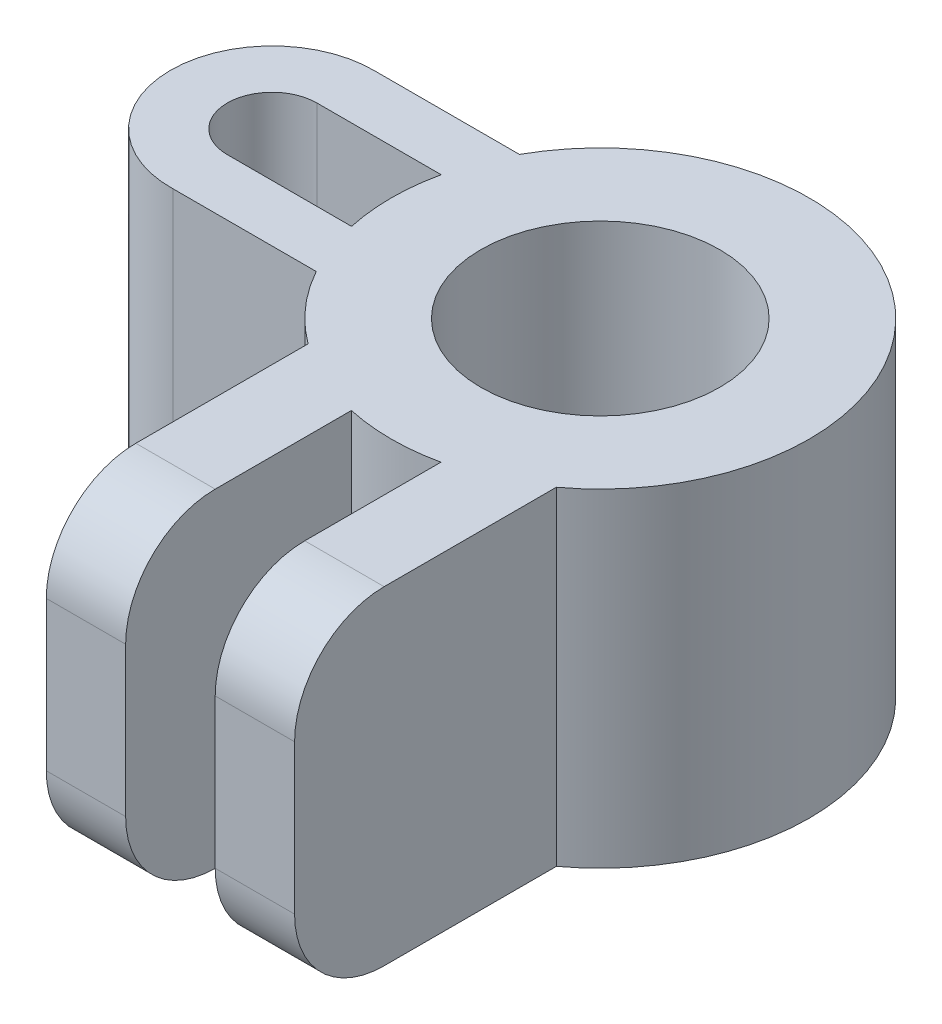
ISO-10303-21;
HEADER;
FILE_DESCRIPTION(('STEP AP214'),'2;1');
FILE_NAME('part.step','',(''),(''),'','','');
FILE_SCHEMA(('AUTOMOTIVE_DESIGN { 1 0 10303 214 1 1 1 1 }'));
ENDSEC;
DATA;
#1=APPLICATION_CONTEXT('core data for automotive mechanical design processes');
#2=APPLICATION_PROTOCOL_DEFINITION('international standard','automotive_design',2000,#1);
#3=PRODUCT_CONTEXT('',#1,'mechanical');
#4=PRODUCT('Part','Part','',(#3));
#5=PRODUCT_RELATED_PRODUCT_CATEGORY('part','',(#4));
#6=PRODUCT_DEFINITION_FORMATION('','',#4);
#7=PRODUCT_DEFINITION_CONTEXT('part definition',#1,'design');
#8=PRODUCT_DEFINITION('design','',#6,#7);
#9=PRODUCT_DEFINITION_SHAPE('','',#8);
#10=(LENGTH_UNIT() NAMED_UNIT(*) SI_UNIT(.MILLI.,.METRE.));
#11=(NAMED_UNIT(*) PLANE_ANGLE_UNIT() SI_UNIT($,.RADIAN.));
#12=(NAMED_UNIT(*) SI_UNIT($,.STERADIAN.) SOLID_ANGLE_UNIT());
#13=UNCERTAINTY_MEASURE_WITH_UNIT(LENGTH_MEASURE(1.E-05),#10,'distance_accuracy_value','');
#14=(GEOMETRIC_REPRESENTATION_CONTEXT(3) GLOBAL_UNCERTAINTY_ASSIGNED_CONTEXT((#13)) GLOBAL_UNIT_ASSIGNED_CONTEXT((#10,
#11,#12)) REPRESENTATION_CONTEXT('',''));
#15=CARTESIAN_POINT('',(0.,0.,0.));
#16=DIRECTION('',(0.,0.,1.));
#17=DIRECTION('',(1.,0.,0.));
#18=AXIS2_PLACEMENT_3D('',#15,#16,#17);
#19=CARTESIAN_POINT('',(0.,55.,0.));
#20=DIRECTION('',(0.,-1.,0.));
#21=DIRECTION('',(0.,0.,-1.));
#22=AXIS2_PLACEMENT_3D('',#19,#20,#21);
#23=CYLINDRICAL_SURFACE('',#22,35.);
#24=CARTESIAN_POINT('',(0.,0.,0.));
#25=DIRECTION('',(0.,1.,0.));
#26=DIRECTION('',(0.,0.,1.));
#27=AXIS2_PLACEMENT_3D('',#24,#25,#26);
#28=CIRCLE('',#27,35.);
#29=CARTESIAN_POINT('',(-7.5,0.,34.1869858279434));
#30=VERTEX_POINT('',#29);
#31=CARTESIAN_POINT('',(7.5,0.,34.1869858279434));
#32=VERTEX_POINT('',#31);
#33=EDGE_CURVE('E261',#30,#32,#28,.T.);
#34=ORIENTED_EDGE('',*,*,#33,.T.);
#35=DIRECTION('',(0.,-1.,0.));
#36=VECTOR('',#35,1.);
#37=CARTESIAN_POINT('',(7.5,55.,34.1869858279434));
#38=LINE('',#37,#36);
#39=CARTESIAN_POINT('',(7.5,55.,34.1869858279434));
#40=VERTEX_POINT('',#39);
#41=EDGE_CURVE('E332',#40,#32,#38,.T.);
#42=ORIENTED_EDGE('',*,*,#41,.F.);
#43=CARTESIAN_POINT('',(0.,55.,0.));
#44=DIRECTION('',(0.,1.,0.));
#45=DIRECTION('',(0.,0.,1.));
#46=AXIS2_PLACEMENT_3D('',#43,#44,#45);
#47=CIRCLE('',#46,35.);
#48=CARTESIAN_POINT('',(-7.5,55.,34.1869858279434));
#49=VERTEX_POINT('',#48);
#50=EDGE_CURVE('E208',#49,#40,#47,.T.);
#51=ORIENTED_EDGE('',*,*,#50,.F.);
#52=DIRECTION('',(0.,-1.,0.));
#53=VECTOR('',#52,1.);
#54=CARTESIAN_POINT('',(-7.5,55.,34.1869858279434));
#55=LINE('',#54,#53);
#56=EDGE_CURVE('E195',#49,#30,#55,.T.);
#57=ORIENTED_EDGE('',*,*,#56,.T.);
#58=EDGE_LOOP('',(#34,#42,#51,#57));
#59=FACE_BOUND('',#58,.T.);
#60=ADVANCED_FACE('F45',(#59),#23,.T.);
#61=CARTESIAN_POINT('',(7.5,55.,0.));
#62=DIRECTION('',(1.,0.,0.));
#63=DIRECTION('',(0.,0.,-1.));
#64=AXIS2_PLACEMENT_3D('',#61,#62,#63);
#65=PLANE('',#64);
#66=DIRECTION('',(0.,-1.,0.));
#67=VECTOR('',#66,1.);
#68=CARTESIAN_POINT('',(7.50000000000001,55.,72.));
#69=LINE('',#68,#67);
#70=CARTESIAN_POINT('',(7.50000000000001,40.,72.));
#71=VERTEX_POINT('',#70);
#72=CARTESIAN_POINT('',(7.50000000000001,15.,72.));
#73=VERTEX_POINT('',#72);
#74=EDGE_CURVE('E328',#71,#73,#69,.T.);
#75=ORIENTED_EDGE('',*,*,#74,.F.);
#76=CARTESIAN_POINT('',(7.50000000000001,40.,57.));
#77=DIRECTION('',(1.,0.,0.));
#78=DIRECTION('',(0.,0.,-1.));
#79=AXIS2_PLACEMENT_3D('',#76,#77,#78);
#80=CIRCLE('',#79,15.);
#81=CARTESIAN_POINT('',(7.50000000000001,55.,57.));
#82=VERTEX_POINT('',#81);
#83=EDGE_CURVE('E366',#71,#82,#80,.F.);
#84=ORIENTED_EDGE('',*,*,#83,.T.);
#85=DIRECTION('',(0.,0.,1.));
#86=VECTOR('',#85,1.);
#87=CARTESIAN_POINT('',(7.5,55.,0.));
#88=LINE('',#87,#86);
#89=EDGE_CURVE('E225',#40,#82,#88,.T.);
#90=ORIENTED_EDGE('',*,*,#89,.F.);
#91=ORIENTED_EDGE('',*,*,#41,.T.);
#92=DIRECTION('',(0.,0.,1.));
#93=VECTOR('',#92,1.);
#94=CARTESIAN_POINT('',(7.5,0.,0.));
#95=LINE('',#94,#93);
#96=CARTESIAN_POINT('',(7.50000000000001,0.,57.));
#97=VERTEX_POINT('',#96);
#98=EDGE_CURVE('E269',#32,#97,#95,.T.);
#99=ORIENTED_EDGE('',*,*,#98,.T.);
#100=CARTESIAN_POINT('',(7.50000000000001,15.,57.));
#101=DIRECTION('',(1.,0.,0.));
#102=DIRECTION('',(0.,0.,-1.));
#103=AXIS2_PLACEMENT_3D('',#100,#101,#102);
#104=CIRCLE('',#103,15.);
#105=EDGE_CURVE('E363',#97,#73,#104,.F.);
#106=ORIENTED_EDGE('',*,*,#105,.T.);
#107=EDGE_LOOP('',(#75,#84,#90,#91,#99,#106));
#108=FACE_BOUND('',#107,.T.);
#109=ADVANCED_FACE('F403',(#108),#65,.F.);
#110=CARTESIAN_POINT('',(0.,55.,72.));
#111=DIRECTION('',(0.,0.,-1.));
#112=DIRECTION('',(-1.,0.,0.));
#113=AXIS2_PLACEMENT_3D('',#110,#111,#112);
#114=PLANE('',#113);
#115=DIRECTION('',(0.,-1.,0.));
#116=VECTOR('',#115,1.);
#117=CARTESIAN_POINT('',(20.7953758307516,55.,72.));
#118=LINE('',#117,#116);
#119=CARTESIAN_POINT('',(20.7953758307516,40.,72.));
#120=VERTEX_POINT('',#119);
#121=CARTESIAN_POINT('',(20.7953758307516,15.,72.));
#122=VERTEX_POINT('',#121);
#123=EDGE_CURVE('E324',#120,#122,#118,.T.);
#124=ORIENTED_EDGE('',*,*,#123,.F.);
#125=DIRECTION('',(1.,0.,0.));
#126=VECTOR('',#125,1.);
#127=CARTESIAN_POINT('',(7.50000000000001,40.,72.));
#128=LINE('',#127,#126);
#129=EDGE_CURVE('E360',#120,#71,#128,.F.);
#130=ORIENTED_EDGE('',*,*,#129,.T.);
#131=ORIENTED_EDGE('',*,*,#74,.T.);
#132=DIRECTION('',(1.,0.,0.));
#133=VECTOR('',#132,1.);
#134=CARTESIAN_POINT('',(0.,15.,72.));
#135=LINE('',#134,#133);
#136=EDGE_CURVE('E356',#73,#122,#135,.T.);
#137=ORIENTED_EDGE('',*,*,#136,.T.);
#138=EDGE_LOOP('',(#124,#130,#131,#137));
#139=FACE_BOUND('',#138,.T.);
#140=ADVANCED_FACE('F466',(#139),#114,.F.);
#141=CARTESIAN_POINT('',(20.7953758307516,55.,0.));
#142=DIRECTION('',(-1.,0.,0.));
#143=DIRECTION('',(0.,0.,1.));
#144=AXIS2_PLACEMENT_3D('',#141,#142,#143);
#145=PLANE('',#144);
#146=DIRECTION('',(0.,0.,-1.));
#147=VECTOR('',#146,1.);
#148=CARTESIAN_POINT('',(20.7953758307516,55.,0.));
#149=LINE('',#148,#147);
#150=CARTESIAN_POINT('',(20.7953758307516,55.,57.));
#151=VERTEX_POINT('',#150);
#152=CARTESIAN_POINT('',(20.7953758307516,55.,28.152306194303));
#153=VERTEX_POINT('',#152);
#154=EDGE_CURVE('E229',#151,#153,#149,.T.);
#155=ORIENTED_EDGE('',*,*,#154,.F.);
#156=CARTESIAN_POINT('',(20.7953758307516,40.,57.));
#157=DIRECTION('',(-1.,0.,0.));
#158=DIRECTION('',(0.,0.,1.));
#159=AXIS2_PLACEMENT_3D('',#156,#157,#158);
#160=CIRCLE('',#159,15.);
#161=EDGE_CURVE('E353',#151,#120,#160,.F.);
#162=ORIENTED_EDGE('',*,*,#161,.T.);
#163=ORIENTED_EDGE('',*,*,#123,.T.);
#164=CARTESIAN_POINT('',(20.7953758307516,15.,57.));
#165=DIRECTION('',(-1.,0.,0.));
#166=DIRECTION('',(0.,0.,1.));
#167=AXIS2_PLACEMENT_3D('',#164,#165,#166);
#168=CIRCLE('',#167,15.);
#169=CARTESIAN_POINT('',(20.7953758307516,0.,57.));
#170=VERTEX_POINT('',#169);
#171=EDGE_CURVE('E350',#122,#170,#168,.F.);
#172=ORIENTED_EDGE('',*,*,#171,.T.);
#173=DIRECTION('',(0.,0.,-1.));
#174=VECTOR('',#173,1.);
#175=CARTESIAN_POINT('',(20.7953758307516,0.,0.));
#176=LINE('',#175,#174);
#177=CARTESIAN_POINT('',(20.7953758307516,0.,28.152306194303));
#178=VERTEX_POINT('',#177);
#179=EDGE_CURVE('E273',#170,#178,#176,.T.);
#180=ORIENTED_EDGE('',*,*,#179,.T.);
#181=DIRECTION('',(0.,-1.,0.));
#182=VECTOR('',#181,1.);
#183=CARTESIAN_POINT('',(20.7953758307516,55.,28.152306194303));
#184=LINE('',#183,#182);
#185=EDGE_CURVE('E320',#153,#178,#184,.T.);
#186=ORIENTED_EDGE('',*,*,#185,.F.);
#187=EDGE_LOOP('',(#155,#162,#163,#172,#180,#186));
#188=FACE_BOUND('',#187,.T.);
#189=ADVANCED_FACE('F412',(#188),#145,.F.);
#190=CARTESIAN_POINT('',(-30.5769903405261,0.,-17.0307857045814));
#191=VERTEX_POINT('',#190);
#192=EDGE_CURVE('E276',#178,#191,#28,.T.);
#193=ORIENTED_EDGE('',*,*,#192,.T.);
#194=DIRECTION('',(0.,-1.,0.));
#195=VECTOR('',#194,1.);
#196=CARTESIAN_POINT('',(-30.5769903405261,55.,-17.0307857045814));
#197=LINE('',#196,#195);
#198=CARTESIAN_POINT('',(-30.5769903405261,55.,-17.0307857045814));
#199=VERTEX_POINT('',#198);
#200=EDGE_CURVE('E316',#199,#191,#197,.T.);
#201=ORIENTED_EDGE('',*,*,#200,.F.);
#202=EDGE_CURVE('E232',#153,#199,#47,.T.);
#203=ORIENTED_EDGE('',*,*,#202,.F.);
#204=ORIENTED_EDGE('',*,*,#185,.T.);
#205=EDGE_LOOP('',(#193,#201,#203,#204));
#206=FACE_BOUND('',#205,.T.);
#207=ADVANCED_FACE('F419',(#206),#23,.T.);
#208=CARTESIAN_POINT('',(0.,55.,-17.0307857045814));
#209=DIRECTION('',(0.,0.,1.));
#210=DIRECTION('',(1.,0.,0.));
#211=AXIS2_PLACEMENT_3D('',#208,#209,#210);
#212=PLANE('',#211);
#213=DIRECTION('',(-1.,0.,0.));
#214=VECTOR('',#213,1.);
#215=CARTESIAN_POINT('',(0.,0.,-17.0307857045814));
#216=LINE('',#215,#214);
#217=CARTESIAN_POINT('',(-54.5769903405261,0.,-17.0307857045814));
#218=VERTEX_POINT('',#217);
#219=EDGE_CURVE('E277',#191,#218,#216,.T.);
#220=ORIENTED_EDGE('',*,*,#219,.T.);
#221=DIRECTION('',(0.,-1.,0.));
#222=VECTOR('',#221,1.);
#223=CARTESIAN_POINT('',(-54.5769903405261,55.,-17.0307857045814));
#224=LINE('',#223,#222);
#225=CARTESIAN_POINT('',(-54.5769903405261,55.,-17.0307857045814));
#226=VERTEX_POINT('',#225);
#227=EDGE_CURVE('E312',#226,#218,#224,.T.);
#228=ORIENTED_EDGE('',*,*,#227,.F.);
#229=DIRECTION('',(-1.,0.,0.));
#230=VECTOR('',#229,1.);
#231=CARTESIAN_POINT('',(0.,55.,-17.0307857045814));
#232=LINE('',#231,#230);
#233=EDGE_CURVE('E233',#199,#226,#232,.T.);
#234=ORIENTED_EDGE('',*,*,#233,.F.);
#235=ORIENTED_EDGE('',*,*,#200,.T.);
#236=EDGE_LOOP('',(#220,#228,#234,#235));
#237=FACE_BOUND('',#236,.T.);
#238=ADVANCED_FACE('F426',(#237),#212,.F.);
#239=CARTESIAN_POINT('',(-54.9999911538681,55.,-0.0311941410011966));
#240=DIRECTION('',(0.,-1.,0.));
#241=DIRECTION('',(0.,0.,-1.));
#242=AXIS2_PLACEMENT_3D('',#239,#240,#241);
#243=CYLINDRICAL_SURFACE('',#242,17.0048535135307);
#244=CARTESIAN_POINT('',(-54.9999911538681,0.,-0.0311941410011966));
#245=DIRECTION('',(0.,1.,0.));
#246=DIRECTION('',(0.,0.,1.));
#247=AXIS2_PLACEMENT_3D('',#244,#245,#246);
#248=CIRCLE('',#247,17.0048535135307);
#249=CARTESIAN_POINT('',(-54.6112032791291,0.,16.9692142954186));
#250=VERTEX_POINT('',#249);
#251=EDGE_CURVE('E280',#218,#250,#248,.T.);
#252=ORIENTED_EDGE('',*,*,#251,.T.);
#253=DIRECTION('',(0.,-1.,0.));
#254=VECTOR('',#253,1.);
#255=CARTESIAN_POINT('',(-54.6112032791291,55.,16.9692142954186));
#256=LINE('',#255,#254);
#257=CARTESIAN_POINT('',(-54.6112032791291,55.,16.9692142954186));
#258=VERTEX_POINT('',#257);
#259=EDGE_CURVE('E309',#258,#250,#256,.T.);
#260=ORIENTED_EDGE('',*,*,#259,.F.);
#261=CARTESIAN_POINT('',(-54.9999911538681,55.,-0.0311941410011966));
#262=DIRECTION('',(0.,1.,0.));
#263=DIRECTION('',(0.,0.,1.));
#264=AXIS2_PLACEMENT_3D('',#261,#262,#263);
#265=CIRCLE('',#264,17.0048535135307);
#266=EDGE_CURVE('E236',#226,#258,#265,.T.);
#267=ORIENTED_EDGE('',*,*,#266,.F.);
#268=ORIENTED_EDGE('',*,*,#227,.T.);
#269=EDGE_LOOP('',(#252,#260,#267,#268));
#270=FACE_BOUND('',#269,.T.);
#271=ADVANCED_FACE('F430',(#270),#243,.T.);
#272=CARTESIAN_POINT('',(0.,55.,16.9692142954186));
#273=DIRECTION('',(0.,0.,1.));
#274=DIRECTION('',(1.,0.,0.));
#275=AXIS2_PLACEMENT_3D('',#272,#273,#274);
#276=PLANE('',#275);
#277=DIRECTION('',(-1.,0.,0.));
#278=VECTOR('',#277,1.);
#279=CARTESIAN_POINT('',(0.,0.,16.9692142954186));
#280=LINE('',#279,#278);
#281=CARTESIAN_POINT('',(-30.6112032791291,0.,16.9692142954186));
#282=VERTEX_POINT('',#281);
#283=EDGE_CURVE('E284',#282,#250,#280,.T.);
#284=ORIENTED_EDGE('',*,*,#283,.F.);
#285=DIRECTION('',(0.,-1.,0.));
#286=VECTOR('',#285,1.);
#287=CARTESIAN_POINT('',(-30.6112032791291,55.,16.9692142954186));
#288=LINE('',#287,#286);
#289=CARTESIAN_POINT('',(-30.6112032791291,55.,16.9692142954186));
#290=VERTEX_POINT('',#289);
#291=EDGE_CURVE('E306',#290,#282,#288,.T.);
#292=ORIENTED_EDGE('',*,*,#291,.F.);
#293=DIRECTION('',(-1.,0.,0.));
#294=VECTOR('',#293,1.);
#295=CARTESIAN_POINT('',(0.,55.,16.9692142954186));
#296=LINE('',#295,#294);
#297=EDGE_CURVE('E239',#290,#258,#296,.T.);
#298=ORIENTED_EDGE('',*,*,#297,.T.);
#299=ORIENTED_EDGE('',*,*,#259,.T.);
#300=EDGE_LOOP('',(#284,#292,#298,#299));
#301=FACE_BOUND('',#300,.T.);
#302=ADVANCED_FACE('F433',(#301),#276,.T.);
#303=CARTESIAN_POINT('',(-20.7953758307516,0.,28.152306194303));
#304=VERTEX_POINT('',#303);
#305=EDGE_CURVE('E260',#282,#304,#28,.T.);
#306=ORIENTED_EDGE('',*,*,#305,.T.);
#307=DIRECTION('',(0.,-1.,0.));
#308=VECTOR('',#307,1.);
#309=CARTESIAN_POINT('',(-20.7953758307516,55.,28.152306194303));
#310=LINE('',#309,#308);
#311=CARTESIAN_POINT('',(-20.7953758307516,55.,28.152306194303));
#312=VERTEX_POINT('',#311);
#313=EDGE_CURVE('E302',#312,#304,#310,.T.);
#314=ORIENTED_EDGE('',*,*,#313,.F.);
#315=EDGE_CURVE('E207',#290,#312,#47,.T.);
#316=ORIENTED_EDGE('',*,*,#315,.F.);
#317=ORIENTED_EDGE('',*,*,#291,.T.);
#318=EDGE_LOOP('',(#306,#314,#316,#317));
#319=FACE_BOUND('',#318,.T.);
#320=ADVANCED_FACE('F440',(#319),#23,.T.);
#321=CARTESIAN_POINT('',(-20.7953758307516,55.,0.));
#322=DIRECTION('',(-1.,0.,0.));
#323=DIRECTION('',(0.,0.,1.));
#324=AXIS2_PLACEMENT_3D('',#321,#322,#323);
#325=PLANE('',#324);
#326=DIRECTION('',(0.,0.,-1.));
#327=VECTOR('',#326,1.);
#328=CARTESIAN_POINT('',(-20.7953758307516,0.,0.));
#329=LINE('',#328,#327);
#330=CARTESIAN_POINT('',(-20.7953758307516,0.,57.));
#331=VERTEX_POINT('',#330);
#332=EDGE_CURVE('E288',#331,#304,#329,.T.);
#333=ORIENTED_EDGE('',*,*,#332,.F.);
#334=CARTESIAN_POINT('',(-20.7953758307516,15.,57.));
#335=DIRECTION('',(-1.,0.,0.));
#336=DIRECTION('',(0.,0.,1.));
#337=AXIS2_PLACEMENT_3D('',#334,#335,#336);
#338=CIRCLE('',#337,15.);
#339=CARTESIAN_POINT('',(-20.7953758307516,15.,72.));
#340=VERTEX_POINT('',#339);
#341=EDGE_CURVE('E379',#331,#340,#338,.T.);
#342=ORIENTED_EDGE('',*,*,#341,.T.);
#343=DIRECTION('',(0.,-1.,0.));
#344=VECTOR('',#343,1.);
#345=CARTESIAN_POINT('',(-20.7953758307516,55.,72.));
#346=LINE('',#345,#344);
#347=CARTESIAN_POINT('',(-20.7953758307516,40.,72.));
#348=VERTEX_POINT('',#347);
#349=EDGE_CURVE('E299',#348,#340,#346,.T.);
#350=ORIENTED_EDGE('',*,*,#349,.F.);
#351=CARTESIAN_POINT('',(-20.7953758307516,40.,57.));
#352=DIRECTION('',(-1.,0.,0.));
#353=DIRECTION('',(0.,0.,1.));
#354=AXIS2_PLACEMENT_3D('',#351,#352,#353);
#355=CIRCLE('',#354,15.);
#356=CARTESIAN_POINT('',(-20.7953758307516,55.,57.));
#357=VERTEX_POINT('',#356);
#358=EDGE_CURVE('E376',#348,#357,#355,.T.);
#359=ORIENTED_EDGE('',*,*,#358,.T.);
#360=DIRECTION('',(0.,0.,-1.));
#361=VECTOR('',#360,1.);
#362=CARTESIAN_POINT('',(-20.7953758307516,55.,0.));
#363=LINE('',#362,#361);
#364=EDGE_CURVE('E243',#357,#312,#363,.T.);
#365=ORIENTED_EDGE('',*,*,#364,.T.);
#366=ORIENTED_EDGE('',*,*,#313,.T.);
#367=EDGE_LOOP('',(#333,#342,#350,#359,#365,#366));
#368=FACE_BOUND('',#367,.T.);
#369=ADVANCED_FACE('F444',(#368),#325,.T.);
#370=CARTESIAN_POINT('',(0.,55.,72.));
#371=DIRECTION('',(0.,0.,1.));
#372=DIRECTION('',(1.,0.,0.));
#373=AXIS2_PLACEMENT_3D('',#370,#371,#372);
#374=PLANE('',#373);
#375=ORIENTED_EDGE('',*,*,#349,.T.);
#376=DIRECTION('',(-1.,0.,0.));
#377=VECTOR('',#376,1.);
#378=CARTESIAN_POINT('',(-7.49999999999999,15.,72.));
#379=LINE('',#378,#377);
#380=CARTESIAN_POINT('',(-7.49999999999999,15.,72.));
#381=VERTEX_POINT('',#380);
#382=EDGE_CURVE('E61',#340,#381,#379,.F.);
#383=ORIENTED_EDGE('',*,*,#382,.T.);
#384=DIRECTION('',(0.,-1.,0.));
#385=VECTOR('',#384,1.);
#386=CARTESIAN_POINT('',(-7.49999999999999,55.,72.));
#387=LINE('',#386,#385);
#388=CARTESIAN_POINT('',(-7.49999999999999,40.,72.));
#389=VERTEX_POINT('',#388);
#390=EDGE_CURVE('E296',#389,#381,#387,.T.);
#391=ORIENTED_EDGE('',*,*,#390,.F.);
#392=DIRECTION('',(-1.,0.,0.));
#393=VECTOR('',#392,1.);
#394=CARTESIAN_POINT('',(0.,40.,72.));
#395=LINE('',#394,#393);
#396=EDGE_CURVE('E382',#389,#348,#395,.T.);
#397=ORIENTED_EDGE('',*,*,#396,.T.);
#398=EDGE_LOOP('',(#375,#383,#391,#397));
#399=FACE_BOUND('',#398,.T.);
#400=ADVANCED_FACE('F448',(#399),#374,.T.);
#401=CARTESIAN_POINT('',(0.,55.,-7.53118789916653));
#402=DIRECTION('',(0.,0.,1.));
#403=DIRECTION('',(1.,0.,0.));
#404=AXIS2_PLACEMENT_3D('',#401,#402,#403);
#405=PLANE('',#404);
#406=DIRECTION('',(-1.,0.,0.));
#407=VECTOR('',#406,1.);
#408=CARTESIAN_POINT('',(0.,0.,-7.53118789916653));
#409=LINE('',#408,#407);
#410=CARTESIAN_POINT('',(-34.1801288591405,0.,-7.53118789916653));
#411=VERTEX_POINT('',#410);
#412=CARTESIAN_POINT('',(-54.9863070375236,0.,-7.53118789916653));
#413=VERTEX_POINT('',#412);
#414=EDGE_CURVE('E190',#411,#413,#409,.T.);
#415=ORIENTED_EDGE('',*,*,#414,.F.);
#416=DIRECTION('',(0.,-1.,0.));
#417=VECTOR('',#416,1.);
#418=CARTESIAN_POINT('',(-34.1801288591405,55.,-7.53118789916653));
#419=LINE('',#418,#417);
#420=CARTESIAN_POINT('',(-34.1801288591405,55.,-7.53118789916653));
#421=VERTEX_POINT('',#420);
#422=EDGE_CURVE('E183',#421,#411,#419,.T.);
#423=ORIENTED_EDGE('',*,*,#422,.F.);
#424=DIRECTION('',(-1.,0.,0.));
#425=VECTOR('',#424,1.);
#426=CARTESIAN_POINT('',(0.,55.,-7.53118789916653));
#427=LINE('',#426,#425);
#428=CARTESIAN_POINT('',(-54.9863070375236,55.,-7.53118789916653));
#429=VERTEX_POINT('',#428);
#430=EDGE_CURVE('E187',#421,#429,#427,.T.);
#431=ORIENTED_EDGE('',*,*,#430,.T.);
#432=DIRECTION('',(0.,-1.,0.));
#433=VECTOR('',#432,1.);
#434=CARTESIAN_POINT('',(-54.9863070375236,55.,-7.53118789916653));
#435=LINE('',#434,#433);
#436=EDGE_CURVE('E253',#429,#413,#435,.T.);
#437=ORIENTED_EDGE('',*,*,#436,.T.);
#438=EDGE_LOOP('',(#415,#423,#431,#437));
#439=FACE_BOUND('',#438,.T.);
#440=ADVANCED_FACE('F185',(#439),#405,.T.);
#441=CARTESIAN_POINT('',(-34.193812975485,0.,7.46881210083347));
#442=VERTEX_POINT('',#441);
#443=EDGE_CURVE('E256',#411,#442,#28,.T.);
#444=ORIENTED_EDGE('',*,*,#443,.T.);
#445=DIRECTION('',(0.,-1.,0.));
#446=VECTOR('',#445,1.);
#447=CARTESIAN_POINT('',(-34.193812975485,55.,7.46881210083347));
#448=LINE('',#447,#446);
#449=CARTESIAN_POINT('',(-34.193812975485,55.,7.46881210083347));
#450=VERTEX_POINT('',#449);
#451=EDGE_CURVE('E196',#450,#442,#448,.T.);
#452=ORIENTED_EDGE('',*,*,#451,.F.);
#453=EDGE_CURVE('E199',#421,#450,#47,.T.);
#454=ORIENTED_EDGE('',*,*,#453,.F.);
#455=ORIENTED_EDGE('',*,*,#422,.T.);
#456=EDGE_LOOP('',(#444,#452,#454,#455));
#457=FACE_BOUND('',#456,.T.);
#458=ADVANCED_FACE('F200',(#457),#23,.T.);
#459=CARTESIAN_POINT('',(0.,55.,7.46881210083347));
#460=DIRECTION('',(0.,0.,-1.));
#461=DIRECTION('',(-1.,0.,0.));
#462=AXIS2_PLACEMENT_3D('',#459,#460,#461);
#463=PLANE('',#462);
#464=DIRECTION('',(1.,0.,0.));
#465=VECTOR('',#464,1.);
#466=CARTESIAN_POINT('',(0.,0.,7.46881210083347));
#467=LINE('',#466,#465);
#468=CARTESIAN_POINT('',(-54.9999911538681,0.,7.46881210083347));
#469=VERTEX_POINT('',#468);
#470=EDGE_CURVE('E259',#469,#442,#467,.T.);
#471=ORIENTED_EDGE('',*,*,#470,.F.);
#472=DIRECTION('',(0.,-1.,0.));
#473=VECTOR('',#472,1.);
#474=CARTESIAN_POINT('',(-54.9999911538681,55.,7.46881210083347));
#475=LINE('',#474,#473);
#476=CARTESIAN_POINT('',(-54.9999911538681,55.,7.46881210083347));
#477=VERTEX_POINT('',#476);
#478=EDGE_CURVE('E339',#477,#469,#475,.T.);
#479=ORIENTED_EDGE('',*,*,#478,.F.);
#480=DIRECTION('',(1.,0.,0.));
#481=VECTOR('',#480,1.);
#482=CARTESIAN_POINT('',(0.,55.,7.46881210083347));
#483=LINE('',#482,#481);
#484=EDGE_CURVE('E205',#477,#450,#483,.T.);
#485=ORIENTED_EDGE('',*,*,#484,.T.);
#486=ORIENTED_EDGE('',*,*,#451,.T.);
#487=EDGE_LOOP('',(#471,#479,#485,#486));
#488=FACE_BOUND('',#487,.T.);
#489=ADVANCED_FACE('F483',(#488),#463,.T.);
#490=CARTESIAN_POINT('',(-7.5,55.,0.));
#491=DIRECTION('',(1.,0.,0.));
#492=DIRECTION('',(0.,0.,-1.));
#493=AXIS2_PLACEMENT_3D('',#490,#491,#492);
#494=PLANE('',#493);
#495=ORIENTED_EDGE('',*,*,#390,.T.);
#496=CARTESIAN_POINT('',(-7.49999999999999,15.,57.));
#497=DIRECTION('',(1.,0.,0.));
#498=DIRECTION('',(0.,0.,-1.));
#499=AXIS2_PLACEMENT_3D('',#496,#497,#498);
#500=CIRCLE('',#499,15.);
#501=CARTESIAN_POINT('',(-7.49999999999999,0.,57.));
#502=VERTEX_POINT('',#501);
#503=EDGE_CURVE('E11',#381,#502,#500,.T.);
#504=ORIENTED_EDGE('',*,*,#503,.T.);
#505=DIRECTION('',(0.,0.,1.));
#506=VECTOR('',#505,1.);
#507=CARTESIAN_POINT('',(-7.5,0.,0.));
#508=LINE('',#507,#506);
#509=EDGE_CURVE('E218',#30,#502,#508,.T.);
#510=ORIENTED_EDGE('',*,*,#509,.F.);
#511=ORIENTED_EDGE('',*,*,#56,.F.);
#512=DIRECTION('',(0.,0.,1.));
#513=VECTOR('',#512,1.);
#514=CARTESIAN_POINT('',(-7.5,55.,0.));
#515=LINE('',#514,#513);
#516=CARTESIAN_POINT('',(-7.49999999999999,55.,57.));
#517=VERTEX_POINT('',#516);
#518=EDGE_CURVE('E246',#49,#517,#515,.T.);
#519=ORIENTED_EDGE('',*,*,#518,.T.);
#520=CARTESIAN_POINT('',(-7.49999999999999,40.,57.));
#521=DIRECTION('',(1.,0.,0.));
#522=DIRECTION('',(0.,0.,-1.));
#523=AXIS2_PLACEMENT_3D('',#520,#521,#522);
#524=CIRCLE('',#523,15.);
#525=EDGE_CURVE('E54',#517,#389,#524,.T.);
#526=ORIENTED_EDGE('',*,*,#525,.T.);
#527=EDGE_LOOP('',(#495,#504,#510,#511,#519,#526));
#528=FACE_BOUND('',#527,.T.);
#529=ADVANCED_FACE('F450',(#528),#494,.T.);
#530=CARTESIAN_POINT('',(-54.9999911538681,55.,-0.0311941410011966));
#531=DIRECTION('',(0.,-1.,0.));
#532=DIRECTION('',(0.,0.,-1.));
#533=AXIS2_PLACEMENT_3D('',#530,#531,#532);
#534=CYLINDRICAL_SURFACE('',#533,7.50000624183467);
#535=CARTESIAN_POINT('',(-54.9999911538681,0.,-0.0311941410011966));
#536=DIRECTION('',(0.,1.,0.));
#537=DIRECTION('',(0.,0.,1.));
#538=AXIS2_PLACEMENT_3D('',#535,#536,#537);
#539=CIRCLE('',#538,7.50000624183467);
#540=EDGE_CURVE('E265',#413,#469,#539,.T.);
#541=ORIENTED_EDGE('',*,*,#540,.F.);
#542=ORIENTED_EDGE('',*,*,#436,.F.);
#543=CARTESIAN_POINT('',(-54.9999911538681,55.,-0.0311941410011966));
#544=DIRECTION('',(0.,1.,0.));
#545=DIRECTION('',(0.,0.,1.));
#546=AXIS2_PLACEMENT_3D('',#543,#544,#545);
#547=CIRCLE('',#546,7.50000624183467);
#548=EDGE_CURVE('E212',#429,#477,#547,.T.);
#549=ORIENTED_EDGE('',*,*,#548,.T.);
#550=ORIENTED_EDGE('',*,*,#478,.T.);
#551=EDGE_LOOP('',(#541,#542,#549,#550));
#552=FACE_BOUND('',#551,.T.);
#553=ADVANCED_FACE('F550',(#552),#534,.F.);
#554=CARTESIAN_POINT('',(0.,55.,0.));
#555=DIRECTION('',(0.,-1.,0.));
#556=DIRECTION('',(0.,0.,-1.));
#557=AXIS2_PLACEMENT_3D('',#554,#555,#556);
#558=CYLINDRICAL_SURFACE('',#557,20.);
#559=CARTESIAN_POINT('',(0.,55.,0.));
#560=DIRECTION('',(0.,1.,0.));
#561=DIRECTION('',(0.,0.,1.));
#562=AXIS2_PLACEMENT_3D('',#559,#560,#561);
#563=CIRCLE('',#562,20.);
#564=CARTESIAN_POINT('',(0.,55.,20.));
#565=VERTEX_POINT('',#564);
#566=EDGE_CURVE('E249',#565,#565,#563,.T.);
#567=ORIENTED_EDGE('',*,*,#566,.T.);
#568=EDGE_LOOP('',(#567));
#569=FACE_BOUND('',#568,.T.);
#570=CARTESIAN_POINT('',(0.,0.,0.));
#571=DIRECTION('',(0.,1.,0.));
#572=DIRECTION('',(0.,0.,1.));
#573=AXIS2_PLACEMENT_3D('',#570,#571,#572);
#574=CIRCLE('',#573,20.);
#575=CARTESIAN_POINT('',(0.,0.,20.));
#576=VERTEX_POINT('',#575);
#577=EDGE_CURVE('E214',#576,#576,#574,.T.);
#578=ORIENTED_EDGE('',*,*,#577,.F.);
#579=EDGE_LOOP('',(#578));
#580=FACE_BOUND('',#579,.T.);
#581=ADVANCED_FACE('F555',(#569,#580),#558,.F.);
#582=CARTESIAN_POINT('',(0.,55.,0.));
#583=DIRECTION('',(0.,1.,0.));
#584=DIRECTION('',(0.,0.,1.));
#585=AXIS2_PLACEMENT_3D('',#582,#583,#584);
#586=PLANE('',#585);
#587=ORIENTED_EDGE('',*,*,#430,.F.);
#588=ORIENTED_EDGE('',*,*,#453,.T.);
#589=ORIENTED_EDGE('',*,*,#484,.F.);
#590=ORIENTED_EDGE('',*,*,#548,.F.);
#591=EDGE_LOOP('',(#587,#588,#589,#590));
#592=FACE_BOUND('',#591,.T.);
#593=ORIENTED_EDGE('',*,*,#89,.T.);
#594=DIRECTION('',(1.,0.,0.));
#595=VECTOR('',#594,1.);
#596=CARTESIAN_POINT('',(20.7953758307516,55.,57.));
#597=LINE('',#596,#595);
#598=EDGE_CURVE('E346',#82,#151,#597,.T.);
#599=ORIENTED_EDGE('',*,*,#598,.T.);
#600=ORIENTED_EDGE('',*,*,#154,.T.);
#601=ORIENTED_EDGE('',*,*,#202,.T.);
#602=ORIENTED_EDGE('',*,*,#233,.T.);
#603=ORIENTED_EDGE('',*,*,#266,.T.);
#604=ORIENTED_EDGE('',*,*,#297,.F.);
#605=ORIENTED_EDGE('',*,*,#315,.T.);
#606=ORIENTED_EDGE('',*,*,#364,.F.);
#607=DIRECTION('',(-1.,0.,0.));
#608=VECTOR('',#607,1.);
#609=CARTESIAN_POINT('',(0.,55.,57.));
#610=LINE('',#609,#608);
#611=EDGE_CURVE('E336',#357,#517,#610,.F.);
#612=ORIENTED_EDGE('',*,*,#611,.T.);
#613=ORIENTED_EDGE('',*,*,#518,.F.);
#614=ORIENTED_EDGE('',*,*,#50,.T.);
#615=EDGE_LOOP('',(#593,#599,#600,#601,#602,#603,#604,#605,#606,#612,#613,#614));
#616=FACE_BOUND('',#615,.T.);
#617=ORIENTED_EDGE('',*,*,#566,.F.);
#618=EDGE_LOOP('',(#617));
#619=FACE_BOUND('',#618,.T.);
#620=ADVANCED_FACE('F209',(#592,#616,#619),#586,.T.);
#621=CARTESIAN_POINT('',(0.,0.,0.));
#622=DIRECTION('',(0.,1.,0.));
#623=DIRECTION('',(0.,0.,1.));
#624=AXIS2_PLACEMENT_3D('',#621,#622,#623);
#625=PLANE('',#624);
#626=ORIENTED_EDGE('',*,*,#414,.T.);
#627=ORIENTED_EDGE('',*,*,#540,.T.);
#628=ORIENTED_EDGE('',*,*,#470,.T.);
#629=ORIENTED_EDGE('',*,*,#443,.F.);
#630=EDGE_LOOP('',(#626,#627,#628,#629));
#631=FACE_BOUND('',#630,.T.);
#632=ORIENTED_EDGE('',*,*,#179,.F.);
#633=DIRECTION('',(1.,0.,0.));
#634=VECTOR('',#633,1.);
#635=CARTESIAN_POINT('',(0.,0.,57.));
#636=LINE('',#635,#634);
#637=EDGE_CURVE('E373',#170,#97,#636,.F.);
#638=ORIENTED_EDGE('',*,*,#637,.T.);
#639=ORIENTED_EDGE('',*,*,#98,.F.);
#640=ORIENTED_EDGE('',*,*,#33,.F.);
#641=ORIENTED_EDGE('',*,*,#509,.T.);
#642=DIRECTION('',(-1.,0.,0.));
#643=VECTOR('',#642,1.);
#644=CARTESIAN_POINT('',(-20.7953758307516,0.,57.));
#645=LINE('',#644,#643);
#646=EDGE_CURVE('E369',#502,#331,#645,.T.);
#647=ORIENTED_EDGE('',*,*,#646,.T.);
#648=ORIENTED_EDGE('',*,*,#332,.T.);
#649=ORIENTED_EDGE('',*,*,#305,.F.);
#650=ORIENTED_EDGE('',*,*,#283,.T.);
#651=ORIENTED_EDGE('',*,*,#251,.F.);
#652=ORIENTED_EDGE('',*,*,#219,.F.);
#653=ORIENTED_EDGE('',*,*,#192,.F.);
#654=EDGE_LOOP('',(#632,#638,#639,#640,#641,#647,#648,#649,#650,#651,#652,#653));
#655=FACE_BOUND('',#654,.T.);
#656=ORIENTED_EDGE('',*,*,#577,.T.);
#657=EDGE_LOOP('',(#656));
#658=FACE_BOUND('',#657,.T.);
#659=ADVANCED_FACE('F456',(#631,#655,#658),#625,.F.);
#660=CARTESIAN_POINT('',(0.,40.,57.));
#661=DIRECTION('',(-1.,0.,0.));
#662=DIRECTION('',(0.,0.,1.));
#663=AXIS2_PLACEMENT_3D('',#660,#661,#662);
#664=CYLINDRICAL_SURFACE('',#663,15.);
#665=ORIENTED_EDGE('',*,*,#83,.F.);
#666=ORIENTED_EDGE('',*,*,#129,.F.);
#667=ORIENTED_EDGE('',*,*,#161,.F.);
#668=ORIENTED_EDGE('',*,*,#598,.F.);
#669=EDGE_LOOP('',(#665,#666,#667,#668));
#670=FACE_BOUND('',#669,.T.);
#671=ADVANCED_FACE('F408',(#670),#664,.T.);
#672=CARTESIAN_POINT('',(0.,15.,57.));
#673=DIRECTION('',(1.,0.,0.));
#674=DIRECTION('',(0.,0.,-1.));
#675=AXIS2_PLACEMENT_3D('',#672,#673,#674);
#676=CYLINDRICAL_SURFACE('',#675,15.);
#677=ORIENTED_EDGE('',*,*,#105,.F.);
#678=ORIENTED_EDGE('',*,*,#637,.F.);
#679=ORIENTED_EDGE('',*,*,#171,.F.);
#680=ORIENTED_EDGE('',*,*,#136,.F.);
#681=EDGE_LOOP('',(#677,#678,#679,#680));
#682=FACE_BOUND('',#681,.T.);
#683=ADVANCED_FACE('F463',(#682),#676,.T.);
#684=CARTESIAN_POINT('',(0.,15.,57.));
#685=DIRECTION('',(1.,0.,0.));
#686=DIRECTION('',(0.,0.,-1.));
#687=AXIS2_PLACEMENT_3D('',#684,#685,#686);
#688=CYLINDRICAL_SURFACE('',#687,15.);
#689=ORIENTED_EDGE('',*,*,#503,.F.);
#690=ORIENTED_EDGE('',*,*,#382,.F.);
#691=ORIENTED_EDGE('',*,*,#341,.F.);
#692=ORIENTED_EDGE('',*,*,#646,.F.);
#693=EDGE_LOOP('',(#689,#690,#691,#692));
#694=FACE_BOUND('',#693,.T.);
#695=ADVANCED_FACE('F454',(#694),#688,.T.);
#696=CARTESIAN_POINT('',(0.,40.,57.));
#697=DIRECTION('',(-1.,0.,0.));
#698=DIRECTION('',(0.,0.,1.));
#699=AXIS2_PLACEMENT_3D('',#696,#697,#698);
#700=CYLINDRICAL_SURFACE('',#699,15.);
#701=ORIENTED_EDGE('',*,*,#525,.F.);
#702=ORIENTED_EDGE('',*,*,#611,.F.);
#703=ORIENTED_EDGE('',*,*,#358,.F.);
#704=ORIENTED_EDGE('',*,*,#396,.F.);
#705=EDGE_LOOP('',(#701,#702,#703,#704));
#706=FACE_BOUND('',#705,.T.);
#707=ADVANCED_FACE('F47',(#706),#700,.T.);
#708=CLOSED_SHELL('',(#60,#109,#140,#189,#207,#238,#271,#302,#320,#369,#400,#440,#458,#489,#529,
#553,#581,#620,#659,#671,#683,#695,#707));
#709=MANIFOLD_SOLID_BREP('B2',#708);
#710=ADVANCED_BREP_SHAPE_REPRESENTATION('',(#18,#709),#14);
#711=SHAPE_DEFINITION_REPRESENTATION(#9,#710);
ENDSEC;
END-ISO-10303-21;
